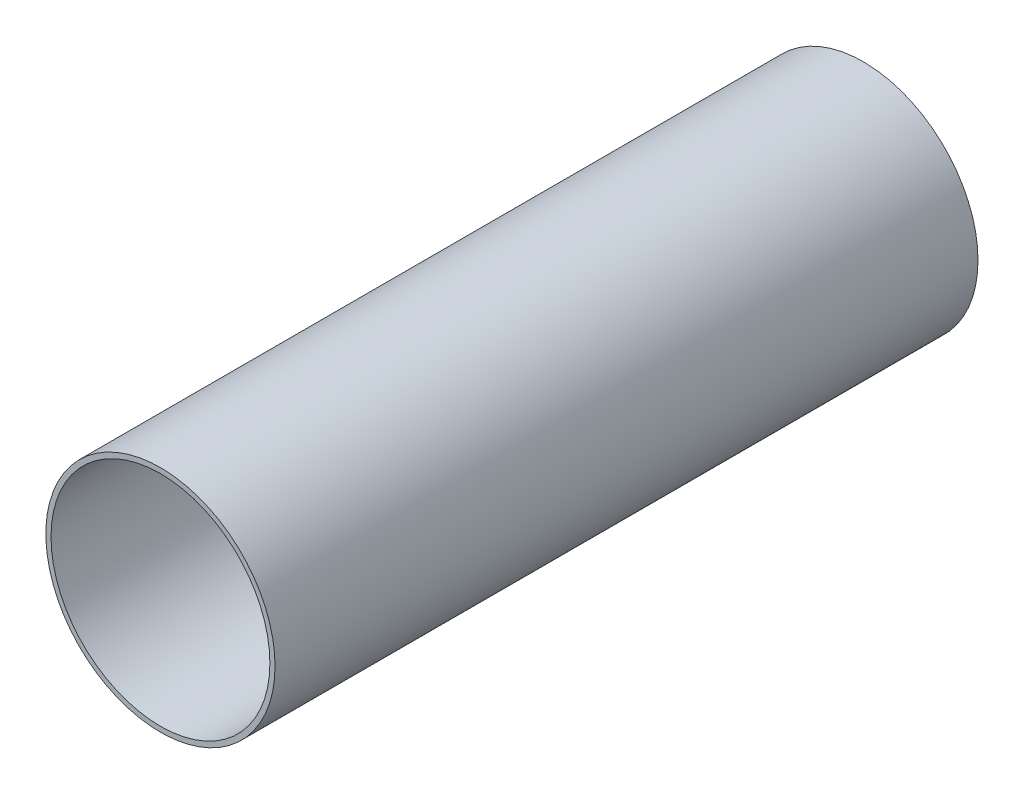
ISO-10303-21;
HEADER;
FILE_DESCRIPTION(('STEP AP214'),'2;1');
FILE_NAME('part.step','',(''),(''),'','','');
FILE_SCHEMA(('AUTOMOTIVE_DESIGN { 1 0 10303 214 1 1 1 1 }'));
ENDSEC;
DATA;
#1=APPLICATION_CONTEXT('core data for automotive mechanical design processes');
#2=APPLICATION_PROTOCOL_DEFINITION('international standard','automotive_design',2000,#1);
#3=PRODUCT_CONTEXT('',#1,'mechanical');
#4=PRODUCT('Part','Part','',(#3));
#5=PRODUCT_RELATED_PRODUCT_CATEGORY('part','',(#4));
#6=PRODUCT_DEFINITION_FORMATION('','',#4);
#7=PRODUCT_DEFINITION_CONTEXT('part definition',#1,'design');
#8=PRODUCT_DEFINITION('design','',#6,#7);
#9=PRODUCT_DEFINITION_SHAPE('','',#8);
#10=(LENGTH_UNIT() NAMED_UNIT(*) SI_UNIT(.MILLI.,.METRE.));
#11=(NAMED_UNIT(*) PLANE_ANGLE_UNIT() SI_UNIT($,.RADIAN.));
#12=(NAMED_UNIT(*) SI_UNIT($,.STERADIAN.) SOLID_ANGLE_UNIT());
#13=UNCERTAINTY_MEASURE_WITH_UNIT(LENGTH_MEASURE(1.E-05),#10,'distance_accuracy_value','');
#14=(GEOMETRIC_REPRESENTATION_CONTEXT(3) GLOBAL_UNCERTAINTY_ASSIGNED_CONTEXT((#13)) GLOBAL_UNIT_ASSIGNED_CONTEXT((#10,
#11,#12)) REPRESENTATION_CONTEXT('',''));
#15=CARTESIAN_POINT('',(0.,0.,0.));
#16=DIRECTION('',(0.,0.,1.));
#17=DIRECTION('',(1.,0.,0.));
#18=AXIS2_PLACEMENT_3D('',#15,#16,#17);
#19=CARTESIAN_POINT('',(0.,0.,81.407));
#20=DIRECTION('',(0.,0.,1.));
#21=DIRECTION('',(1.,0.,0.));
#22=AXIS2_PLACEMENT_3D('',#19,#20,#21);
#23=PLANE('',#22);
#24=CARTESIAN_POINT('',(0.,0.,81.407));
#25=DIRECTION('',(0.,0.,1.));
#26=DIRECTION('',(1.,0.,0.));
#27=AXIS2_PLACEMENT_3D('',#24,#25,#26);
#28=CIRCLE('',#27,26.543);
#29=CARTESIAN_POINT('',(26.543,0.,81.407));
#30=VERTEX_POINT('',#29);
#31=EDGE_CURVE('E10',#30,#30,#28,.T.);
#32=ORIENTED_EDGE('',*,*,#31,.T.);
#33=EDGE_LOOP('',(#32));
#34=FACE_BOUND('',#33,.T.);
#35=CARTESIAN_POINT('',(0.,0.,81.407));
#36=DIRECTION('',(0.,0.,1.));
#37=DIRECTION('',(1.,0.,0.));
#38=AXIS2_PLACEMENT_3D('',#35,#36,#37);
#39=CIRCLE('',#38,25.3492);
#40=CARTESIAN_POINT('',(25.3492,0.,81.407));
#41=VERTEX_POINT('',#40);
#42=EDGE_CURVE('E54',#41,#41,#39,.T.);
#43=ORIENTED_EDGE('',*,*,#42,.F.);
#44=EDGE_LOOP('',(#43));
#45=FACE_BOUND('',#44,.T.);
#46=ADVANCED_FACE('F41',(#34,#45),#23,.T.);
#47=CARTESIAN_POINT('',(0.,0.,-81.407));
#48=DIRECTION('',(0.,0.,1.));
#49=DIRECTION('',(1.,0.,0.));
#50=AXIS2_PLACEMENT_3D('',#47,#48,#49);
#51=PLANE('',#50);
#52=CARTESIAN_POINT('',(0.,0.,-81.407));
#53=DIRECTION('',(0.,0.,1.));
#54=DIRECTION('',(1.,0.,0.));
#55=AXIS2_PLACEMENT_3D('',#52,#53,#54);
#56=CIRCLE('',#55,26.543);
#57=CARTESIAN_POINT('',(26.543,0.,-81.407));
#58=VERTEX_POINT('',#57);
#59=EDGE_CURVE('E45',#58,#58,#56,.T.);
#60=ORIENTED_EDGE('',*,*,#59,.F.);
#61=EDGE_LOOP('',(#60));
#62=FACE_BOUND('',#61,.T.);
#63=CARTESIAN_POINT('',(0.,0.,-81.407));
#64=DIRECTION('',(0.,0.,1.));
#65=DIRECTION('',(1.,0.,0.));
#66=AXIS2_PLACEMENT_3D('',#63,#64,#65);
#67=CIRCLE('',#66,25.3492);
#68=CARTESIAN_POINT('',(25.3492,0.,-81.407));
#69=VERTEX_POINT('',#68);
#70=EDGE_CURVE('E56',#69,#69,#67,.T.);
#71=ORIENTED_EDGE('',*,*,#70,.T.);
#72=EDGE_LOOP('',(#71));
#73=FACE_BOUND('',#72,.T.);
#74=ADVANCED_FACE('F68',(#62,#73),#51,.F.);
#75=CARTESIAN_POINT('',(0.,0.,81.407));
#76=DIRECTION('',(0.,0.,-1.));
#77=DIRECTION('',(-1.,0.,0.));
#78=AXIS2_PLACEMENT_3D('',#75,#76,#77);
#79=CYLINDRICAL_SURFACE('',#78,26.543);
#80=ORIENTED_EDGE('',*,*,#31,.F.);
#81=EDGE_LOOP('',(#80));
#82=FACE_BOUND('',#81,.T.);
#83=ORIENTED_EDGE('',*,*,#59,.T.);
#84=EDGE_LOOP('',(#83));
#85=FACE_BOUND('',#84,.T.);
#86=ADVANCED_FACE('F43',(#82,#85),#79,.T.);
#87=CARTESIAN_POINT('',(0.,0.,81.407));
#88=DIRECTION('',(0.,0.,-1.));
#89=DIRECTION('',(-1.,0.,0.));
#90=AXIS2_PLACEMENT_3D('',#87,#88,#89);
#91=CYLINDRICAL_SURFACE('',#90,25.3492);
#92=ORIENTED_EDGE('',*,*,#42,.T.);
#93=EDGE_LOOP('',(#92));
#94=FACE_BOUND('',#93,.T.);
#95=ORIENTED_EDGE('',*,*,#70,.F.);
#96=EDGE_LOOP('',(#95));
#97=FACE_BOUND('',#96,.T.);
#98=ADVANCED_FACE('F64',(#94,#97),#91,.F.);
#99=CLOSED_SHELL('',(#46,#74,#86,#98));
#100=MANIFOLD_SOLID_BREP('B2',#99);
#101=ADVANCED_BREP_SHAPE_REPRESENTATION('',(#18,#100),#14);
#102=SHAPE_DEFINITION_REPRESENTATION(#9,#101);
ENDSEC;
END-ISO-10303-21;
